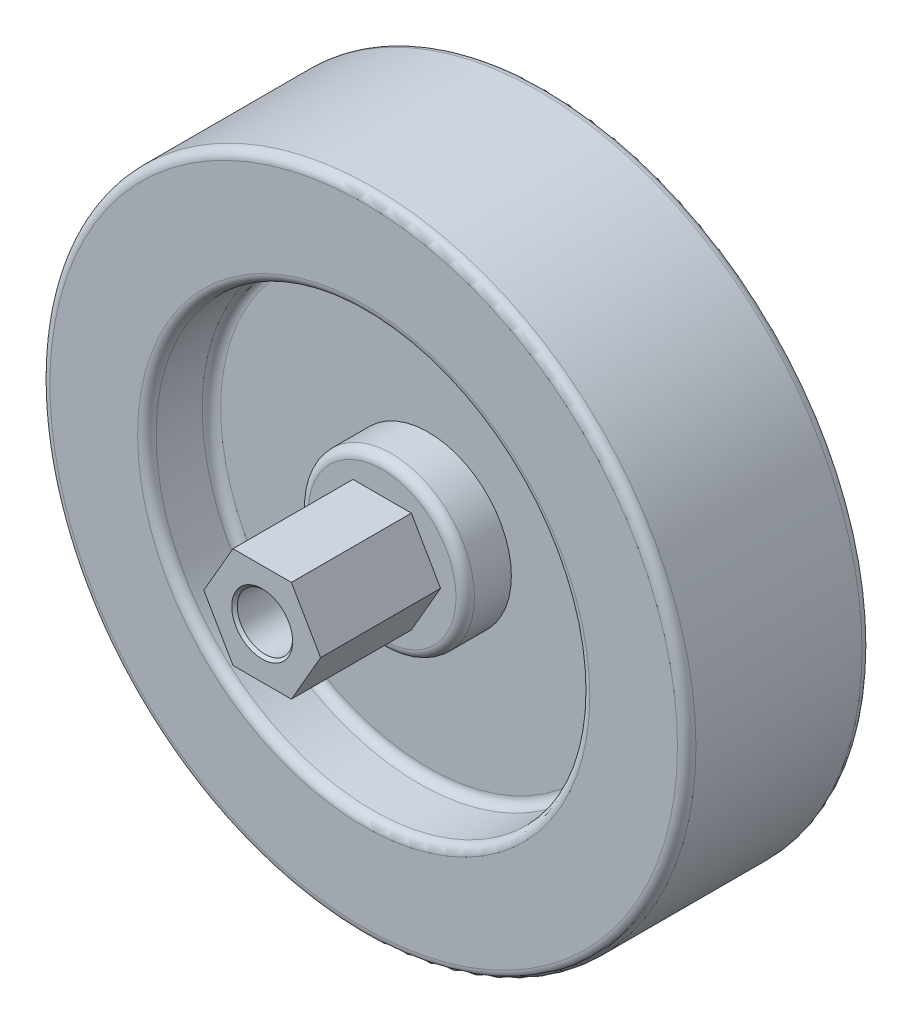
ISO-10303-21;
HEADER;
FILE_DESCRIPTION(('STEP AP214'),'2;1');
FILE_NAME('part.step','',(''),(''),'','','');
FILE_SCHEMA(('AUTOMOTIVE_DESIGN { 1 0 10303 214 1 1 1 1 }'));
ENDSEC;
DATA;
#1=APPLICATION_CONTEXT('core data for automotive mechanical design processes');
#2=APPLICATION_PROTOCOL_DEFINITION('international standard','automotive_design',2000,#1);
#3=PRODUCT_CONTEXT('',#1,'mechanical');
#4=PRODUCT('Part','Part','',(#3));
#5=PRODUCT_RELATED_PRODUCT_CATEGORY('part','',(#4));
#6=PRODUCT_DEFINITION_FORMATION('','',#4);
#7=PRODUCT_DEFINITION_CONTEXT('part definition',#1,'design');
#8=PRODUCT_DEFINITION('design','',#6,#7);
#9=PRODUCT_DEFINITION_SHAPE('','',#8);
#10=(LENGTH_UNIT() NAMED_UNIT(*) SI_UNIT(.MILLI.,.METRE.));
#11=(NAMED_UNIT(*) PLANE_ANGLE_UNIT() SI_UNIT($,.RADIAN.));
#12=(NAMED_UNIT(*) SI_UNIT($,.STERADIAN.) SOLID_ANGLE_UNIT());
#13=UNCERTAINTY_MEASURE_WITH_UNIT(LENGTH_MEASURE(1.E-05),#10,'distance_accuracy_value','');
#14=(GEOMETRIC_REPRESENTATION_CONTEXT(3) GLOBAL_UNCERTAINTY_ASSIGNED_CONTEXT((#13)) GLOBAL_UNIT_ASSIGNED_CONTEXT((#10,
#11,#12)) REPRESENTATION_CONTEXT('',''));
#15=CARTESIAN_POINT('',(0.,0.,0.));
#16=DIRECTION('',(0.,0.,1.));
#17=DIRECTION('',(1.,0.,0.));
#18=AXIS2_PLACEMENT_3D('',#15,#16,#17);
#19=CARTESIAN_POINT('',(0.,0.,20.));
#20=DIRECTION('',(0.,0.,1.));
#21=DIRECTION('',(1.,0.,0.));
#22=AXIS2_PLACEMENT_3D('',#19,#20,#21);
#23=PLANE('',#22);
#24=CARTESIAN_POINT('',(0.,0.,20.));
#25=DIRECTION('',(0.,0.,1.));
#26=DIRECTION('',(1.,0.,0.));
#27=AXIS2_PLACEMENT_3D('',#24,#25,#26);
#28=CIRCLE('',#27,24.5);
#29=CARTESIAN_POINT('',(24.5000000000001,0.,20.));
#30=VERTEX_POINT('',#29);
#31=EDGE_CURVE('E168',#30,#30,#28,.F.);
#32=ORIENTED_EDGE('',*,*,#31,.T.);
#33=EDGE_LOOP('',(#32));
#34=FACE_BOUND('',#33,.T.);
#35=CARTESIAN_POINT('',(0.,0.,20.));
#36=DIRECTION('',(0.,0.,1.));
#37=DIRECTION('',(1.,0.,0.));
#38=AXIS2_PLACEMENT_3D('',#35,#36,#37);
#39=CIRCLE('',#38,34.);
#40=CARTESIAN_POINT('',(34.0000000000001,0.,20.));
#41=VERTEX_POINT('',#40);
#42=EDGE_CURVE('E165',#41,#41,#39,.T.);
#43=ORIENTED_EDGE('',*,*,#42,.T.);
#44=EDGE_LOOP('',(#43));
#45=FACE_BOUND('',#44,.T.);
#46=ADVANCED_FACE('F44',(#34,#45),#23,.T.);
#47=CARTESIAN_POINT('',(0.,0.,0.));
#48=DIRECTION('',(0.,0.,1.));
#49=DIRECTION('',(1.,0.,0.));
#50=AXIS2_PLACEMENT_3D('',#47,#48,#49);
#51=PLANE('',#50);
#52=CARTESIAN_POINT('',(0.,0.,0.));
#53=DIRECTION('',(0.,0.,1.));
#54=DIRECTION('',(1.,0.,0.));
#55=AXIS2_PLACEMENT_3D('',#52,#53,#54);
#56=CIRCLE('',#55,25.);
#57=CARTESIAN_POINT('',(25.,0.,0.));
#58=VERTEX_POINT('',#57);
#59=EDGE_CURVE('E177',#58,#58,#56,.T.);
#60=ORIENTED_EDGE('',*,*,#59,.T.);
#61=EDGE_LOOP('',(#60));
#62=FACE_BOUND('',#61,.T.);
#63=CARTESIAN_POINT('',(0.,0.,0.));
#64=DIRECTION('',(0.,0.,1.));
#65=DIRECTION('',(1.,0.,0.));
#66=AXIS2_PLACEMENT_3D('',#63,#64,#65);
#67=CIRCLE('',#66,34.);
#68=CARTESIAN_POINT('',(34.0000000000001,0.,0.));
#69=VERTEX_POINT('',#68);
#70=EDGE_CURVE('E174',#69,#69,#67,.F.);
#71=ORIENTED_EDGE('',*,*,#70,.T.);
#72=EDGE_LOOP('',(#71));
#73=FACE_BOUND('',#72,.T.);
#74=ADVANCED_FACE('F205',(#62,#73),#51,.F.);
#75=CARTESIAN_POINT('',(0.,0.,20.));
#76=DIRECTION('',(0.,0.,-1.));
#77=DIRECTION('',(-1.,0.,0.));
#78=AXIS2_PLACEMENT_3D('',#75,#76,#77);
#79=CYLINDRICAL_SURFACE('',#78,35.);
#80=CARTESIAN_POINT('',(0.,0.,1.));
#81=DIRECTION('',(0.,0.,1.));
#82=DIRECTION('',(1.,0.,0.));
#83=AXIS2_PLACEMENT_3D('',#80,#81,#82);
#84=CIRCLE('',#83,35.);
#85=CARTESIAN_POINT('',(35.0000000000001,0.,1.));
#86=VERTEX_POINT('',#85);
#87=EDGE_CURVE('E183',#86,#86,#84,.T.);
#88=ORIENTED_EDGE('',*,*,#87,.T.);
#89=EDGE_LOOP('',(#88));
#90=FACE_BOUND('',#89,.T.);
#91=CARTESIAN_POINT('',(0.,0.,19.));
#92=DIRECTION('',(0.,0.,1.));
#93=DIRECTION('',(1.,0.,0.));
#94=AXIS2_PLACEMENT_3D('',#91,#92,#93);
#95=CIRCLE('',#94,35.);
#96=CARTESIAN_POINT('',(35.0000000000001,-1.16295861829485E-13,19.));
#97=VERTEX_POINT('',#96);
#98=EDGE_CURVE('E180',#97,#97,#95,.F.);
#99=ORIENTED_EDGE('',*,*,#98,.T.);
#100=EDGE_LOOP('',(#99));
#101=FACE_BOUND('',#100,.T.);
#102=ADVANCED_FACE('F211',(#90,#101),#79,.T.);
#103=CARTESIAN_POINT('',(0.,0.,20.));
#104=DIRECTION('',(0.,0.,-1.));
#105=DIRECTION('',(-1.,0.,0.));
#106=AXIS2_PLACEMENT_3D('',#103,#104,#105);
#107=CYLINDRICAL_SURFACE('',#106,23.5);
#108=CARTESIAN_POINT('',(0.,0.,14.));
#109=DIRECTION('',(0.,0.,1.));
#110=DIRECTION('',(1.,0.,0.));
#111=AXIS2_PLACEMENT_3D('',#108,#109,#110);
#112=CIRCLE('',#111,23.5);
#113=CARTESIAN_POINT('',(23.5000000000001,0.,14.));
#114=VERTEX_POINT('',#113);
#115=EDGE_CURVE('E162',#114,#114,#112,.F.);
#116=ORIENTED_EDGE('',*,*,#115,.T.);
#117=EDGE_LOOP('',(#116));
#118=FACE_BOUND('',#117,.T.);
#119=CARTESIAN_POINT('',(0.,0.,19.));
#120=DIRECTION('',(0.,0.,1.));
#121=DIRECTION('',(1.,0.,0.));
#122=AXIS2_PLACEMENT_3D('',#119,#120,#121);
#123=CIRCLE('',#122,23.5);
#124=CARTESIAN_POINT('',(23.5000000000001,-1.05443431763774E-13,19.));
#125=VERTEX_POINT('',#124);
#126=EDGE_CURVE('E159',#125,#125,#123,.T.);
#127=ORIENTED_EDGE('',*,*,#126,.T.);
#128=EDGE_LOOP('',(#127));
#129=FACE_BOUND('',#128,.T.);
#130=ADVANCED_FACE('F216',(#118,#129),#107,.F.);
#131=CARTESIAN_POINT('',(0.,0.,13.));
#132=DIRECTION('',(0.,0.,1.));
#133=DIRECTION('',(1.,0.,0.));
#134=AXIS2_PLACEMENT_3D('',#131,#132,#133);
#135=PLANE('',#134);
#136=CARTESIAN_POINT('',(0.,0.,13.));
#137=DIRECTION('',(0.,0.,1.));
#138=DIRECTION('',(1.,0.,0.));
#139=AXIS2_PLACEMENT_3D('',#136,#137,#138);
#140=CIRCLE('',#139,22.5);
#141=CARTESIAN_POINT('',(22.5000000000001,0.,13.));
#142=VERTEX_POINT('',#141);
#143=EDGE_CURVE('E156',#142,#142,#140,.T.);
#144=ORIENTED_EDGE('',*,*,#143,.T.);
#145=EDGE_LOOP('',(#144));
#146=FACE_BOUND('',#145,.T.);
#147=CARTESIAN_POINT('',(0.,0.,13.));
#148=DIRECTION('',(0.,0.,1.));
#149=DIRECTION('',(1.,0.,0.));
#150=AXIS2_PLACEMENT_3D('',#147,#148,#149);
#151=CIRCLE('',#150,9.);
#152=CARTESIAN_POINT('',(9.00000000000006,0.,13.));
#153=VERTEX_POINT('',#152);
#154=EDGE_CURVE('E133',#153,#153,#151,.T.);
#155=ORIENTED_EDGE('',*,*,#154,.F.);
#156=EDGE_LOOP('',(#155));
#157=FACE_BOUND('',#156,.T.);
#158=ADVANCED_FACE('F303',(#146,#157),#135,.T.);
#159=CARTESIAN_POINT('',(0.,0.,13.));
#160=DIRECTION('',(0.,0.,1.));
#161=DIRECTION('',(1.,0.,0.));
#162=AXIS2_PLACEMENT_3D('',#159,#160,#161);
#163=CYLINDRICAL_SURFACE('',#162,9.);
#164=CARTESIAN_POINT('',(0.,0.,17.));
#165=DIRECTION('',(0.,0.,1.));
#166=DIRECTION('',(1.,0.,0.));
#167=AXIS2_PLACEMENT_3D('',#164,#165,#166);
#168=CIRCLE('',#167,9.);
#169=CARTESIAN_POINT('',(9.,0.,17.));
#170=VERTEX_POINT('',#169);
#171=EDGE_CURVE('E153',#170,#170,#168,.F.);
#172=ORIENTED_EDGE('',*,*,#171,.T.);
#173=EDGE_LOOP('',(#172));
#174=FACE_BOUND('',#173,.T.);
#175=ORIENTED_EDGE('',*,*,#154,.T.);
#176=EDGE_LOOP('',(#175));
#177=FACE_BOUND('',#176,.T.);
#178=ADVANCED_FACE('F311',(#174,#177),#163,.T.);
#179=CARTESIAN_POINT('',(0.,0.,31.));
#180=DIRECTION('',(0.,0.,1.));
#181=DIRECTION('',(1.,0.,0.));
#182=AXIS2_PLACEMENT_3D('',#179,#180,#181);
#183=PLANE('',#182);
#184=CARTESIAN_POINT('',(0.,0.,31.));
#185=DIRECTION('',(0.,0.,1.));
#186=DIRECTION('',(1.,0.,0.));
#187=AXIS2_PLACEMENT_3D('',#184,#185,#186);
#188=CIRCLE('',#187,3.29999999999998);
#189=CARTESIAN_POINT('',(3.29999999999997,0.,31.));
#190=VERTEX_POINT('',#189);
#191=EDGE_CURVE('E11',#190,#190,#188,.F.);
#192=ORIENTED_EDGE('',*,*,#191,.T.);
#193=EDGE_LOOP('',(#192));
#194=FACE_BOUND('',#193,.T.);
#195=DIRECTION('',(0.500000000000002,0.866025403784438,0.));
#196=VECTOR('',#195,1.);
#197=CARTESIAN_POINT('',(3.16357794064081,-5.47947772689407,31.));
#198=LINE('',#197,#196);
#199=CARTESIAN_POINT('',(3.16357794064081,-5.47947772689407,31.));
#200=VERTEX_POINT('',#199);
#201=CARTESIAN_POINT('',(6.3271558812816,0.,31.));
#202=VERTEX_POINT('',#201);
#203=EDGE_CURVE('E141',#200,#202,#198,.T.);
#204=ORIENTED_EDGE('',*,*,#203,.T.);
#205=DIRECTION('',(-0.5,0.866025403784442,0.));
#206=VECTOR('',#205,1.);
#207=CARTESIAN_POINT('',(6.3271558812816,0.,31.));
#208=LINE('',#207,#206);
#209=CARTESIAN_POINT('',(3.16357794064082,5.47947772689397,31.));
#210=VERTEX_POINT('',#209);
#211=EDGE_CURVE('E96',#202,#210,#208,.T.);
#212=ORIENTED_EDGE('',*,*,#211,.T.);
#213=DIRECTION('',(-1.,0.,0.));
#214=VECTOR('',#213,1.);
#215=CARTESIAN_POINT('',(3.16357794064082,5.47947772689397,31.));
#216=LINE('',#215,#214);
#217=CARTESIAN_POINT('',(-3.16357794064081,5.479477726894,30.9999999999999));
#218=VERTEX_POINT('',#217);
#219=EDGE_CURVE('E109',#210,#218,#216,.T.);
#220=ORIENTED_EDGE('',*,*,#219,.T.);
#221=DIRECTION('',(-0.500000000000002,-0.866025403784438,0.));
#222=VECTOR('',#221,1.);
#223=CARTESIAN_POINT('',(-3.16357794064081,5.479477726894,30.9999999999999));
#224=LINE('',#223,#222);
#225=CARTESIAN_POINT('',(-6.32715588128163,0.,30.9999999999999));
#226=VERTEX_POINT('',#225);
#227=EDGE_CURVE('E103',#218,#226,#224,.T.);
#228=ORIENTED_EDGE('',*,*,#227,.T.);
#229=DIRECTION('',(0.499999999999999,-0.866025403784442,0.));
#230=VECTOR('',#229,1.);
#231=CARTESIAN_POINT('',(-6.32715588128163,0.,30.9999999999999));
#232=LINE('',#231,#230);
#233=CARTESIAN_POINT('',(-3.16357794064084,-5.4794777268941,31.));
#234=VERTEX_POINT('',#233);
#235=EDGE_CURVE('E107',#226,#234,#232,.T.);
#236=ORIENTED_EDGE('',*,*,#235,.T.);
#237=DIRECTION('',(1.,0.,0.));
#238=VECTOR('',#237,1.);
#239=CARTESIAN_POINT('',(-3.16357794064084,-5.4794777268941,31.));
#240=LINE('',#239,#238);
#241=EDGE_CURVE('E68',#234,#200,#240,.T.);
#242=ORIENTED_EDGE('',*,*,#241,.T.);
#243=EDGE_LOOP('',(#204,#212,#220,#228,#236,#242));
#244=FACE_BOUND('',#243,.T.);
#245=ADVANCED_FACE('F105',(#194,#244),#183,.T.);
#246=CARTESIAN_POINT('',(3.16357794064082,5.47947772689397,31.));
#247=DIRECTION('',(0.,-1.,0.));
#248=DIRECTION('',(1.,0.,0.));
#249=AXIS2_PLACEMENT_3D('',#246,#247,#248);
#250=PLANE('',#249);
#251=DIRECTION('',(-1.,0.,0.));
#252=VECTOR('',#251,1.);
#253=CARTESIAN_POINT('',(3.16357794064089,5.47947772689392,18.));
#254=LINE('',#253,#252);
#255=CARTESIAN_POINT('',(3.16357794064089,5.47947772689392,18.));
#256=VERTEX_POINT('',#255);
#257=CARTESIAN_POINT('',(-3.16357794064074,5.47947772689396,18.));
#258=VERTEX_POINT('',#257);
#259=EDGE_CURVE('E135',#256,#258,#254,.T.);
#260=ORIENTED_EDGE('',*,*,#259,.T.);
#261=DIRECTION('',(0.,0.,-1.));
#262=VECTOR('',#261,1.);
#263=CARTESIAN_POINT('',(-3.16357794064081,5.479477726894,30.9999999999999));
#264=LINE('',#263,#262);
#265=EDGE_CURVE('E121',#218,#258,#264,.T.);
#266=ORIENTED_EDGE('',*,*,#265,.F.);
#267=ORIENTED_EDGE('',*,*,#219,.F.);
#268=DIRECTION('',(0.,0.,-1.));
#269=VECTOR('',#268,1.);
#270=CARTESIAN_POINT('',(3.16357794064082,5.47947772689397,31.));
#271=LINE('',#270,#269);
#272=EDGE_CURVE('E145',#210,#256,#271,.T.);
#273=ORIENTED_EDGE('',*,*,#272,.T.);
#274=EDGE_LOOP('',(#260,#266,#267,#273));
#275=FACE_BOUND('',#274,.T.);
#276=ADVANCED_FACE('F329',(#275),#250,.F.);
#277=CARTESIAN_POINT('',(-3.16357794064081,5.479477726894,30.9999999999999));
#278=DIRECTION('',(0.866025403784439,-0.500000000000004,0.));
#279=DIRECTION('',(0.500000000000002,0.866025403784439,0.));
#280=AXIS2_PLACEMENT_3D('',#277,#278,#279);
#281=PLANE('',#280);
#282=DIRECTION('',(-0.500000000000002,-0.866025403784438,0.));
#283=VECTOR('',#282,1.);
#284=CARTESIAN_POINT('',(-3.16357794064074,5.47947772689396,18.));
#285=LINE('',#284,#283);
#286=CARTESIAN_POINT('',(-6.32715588128158,0.,18.));
#287=VERTEX_POINT('',#286);
#288=EDGE_CURVE('E118',#258,#287,#285,.T.);
#289=ORIENTED_EDGE('',*,*,#288,.T.);
#290=DIRECTION('',(0.,0.,-1.));
#291=VECTOR('',#290,1.);
#292=CARTESIAN_POINT('',(-6.32715588128163,0.,30.9999999999999));
#293=LINE('',#292,#291);
#294=EDGE_CURVE('E115',#226,#287,#293,.T.);
#295=ORIENTED_EDGE('',*,*,#294,.F.);
#296=ORIENTED_EDGE('',*,*,#227,.F.);
#297=ORIENTED_EDGE('',*,*,#265,.T.);
#298=EDGE_LOOP('',(#289,#295,#296,#297));
#299=FACE_BOUND('',#298,.T.);
#300=ADVANCED_FACE('F116',(#299),#281,.F.);
#301=CARTESIAN_POINT('',(-6.32715588128163,0.,30.9999999999999));
#302=DIRECTION('',(0.866025403784441,0.499999999999997,0.));
#303=DIRECTION('',(-0.499999999999999,0.866025403784442,0.));
#304=AXIS2_PLACEMENT_3D('',#301,#302,#303);
#305=PLANE('',#304);
#306=DIRECTION('',(0.499999999999999,-0.866025403784442,0.));
#307=VECTOR('',#306,1.);
#308=CARTESIAN_POINT('',(-6.32715588128158,0.,18.));
#309=LINE('',#308,#307);
#310=CARTESIAN_POINT('',(-3.16357794064073,-5.47947772689408,18.));
#311=VERTEX_POINT('',#310);
#312=EDGE_CURVE('E138',#287,#311,#309,.T.);
#313=ORIENTED_EDGE('',*,*,#312,.T.);
#314=DIRECTION('',(0.,0.,-1.));
#315=VECTOR('',#314,1.);
#316=CARTESIAN_POINT('',(-3.16357794064084,-5.4794777268941,31.));
#317=LINE('',#316,#315);
#318=EDGE_CURVE('E60',#234,#311,#317,.T.);
#319=ORIENTED_EDGE('',*,*,#318,.F.);
#320=ORIENTED_EDGE('',*,*,#235,.F.);
#321=ORIENTED_EDGE('',*,*,#294,.T.);
#322=EDGE_LOOP('',(#313,#319,#320,#321));
#323=FACE_BOUND('',#322,.T.);
#324=ADVANCED_FACE('F123',(#323),#305,.F.);
#325=CARTESIAN_POINT('',(-3.16357794064084,-5.4794777268941,31.));
#326=DIRECTION('',(0.,1.,0.));
#327=DIRECTION('',(-1.,0.,0.));
#328=AXIS2_PLACEMENT_3D('',#325,#326,#327);
#329=PLANE('',#328);
#330=DIRECTION('',(1.,0.,0.));
#331=VECTOR('',#330,1.);
#332=CARTESIAN_POINT('',(-3.16357794064073,-5.47947772689408,18.));
#333=LINE('',#332,#331);
#334=CARTESIAN_POINT('',(3.16357794064092,-5.47947772689415,17.9999999999999));
#335=VERTEX_POINT('',#334);
#336=EDGE_CURVE('E88',#311,#335,#333,.T.);
#337=ORIENTED_EDGE('',*,*,#336,.T.);
#338=DIRECTION('',(0.,0.,-1.));
#339=VECTOR('',#338,1.);
#340=CARTESIAN_POINT('',(3.16357794064081,-5.47947772689407,31.));
#341=LINE('',#340,#339);
#342=EDGE_CURVE('E125',#200,#335,#341,.T.);
#343=ORIENTED_EDGE('',*,*,#342,.F.);
#344=ORIENTED_EDGE('',*,*,#241,.F.);
#345=ORIENTED_EDGE('',*,*,#318,.T.);
#346=EDGE_LOOP('',(#337,#343,#344,#345));
#347=FACE_BOUND('',#346,.T.);
#348=ADVANCED_FACE('F355',(#347),#329,.F.);
#349=CARTESIAN_POINT('',(3.16357794064081,-5.47947772689407,31.));
#350=DIRECTION('',(-0.866025403784439,0.500000000000004,0.));
#351=DIRECTION('',(-0.500000000000002,-0.866025403784439,0.));
#352=AXIS2_PLACEMENT_3D('',#349,#350,#351);
#353=PLANE('',#352);
#354=DIRECTION('',(0.500000000000002,0.866025403784438,0.));
#355=VECTOR('',#354,1.);
#356=CARTESIAN_POINT('',(3.16357794064092,-5.47947772689415,17.9999999999999));
#357=LINE('',#356,#355);
#358=CARTESIAN_POINT('',(6.32715588128171,0.,18.));
#359=VERTEX_POINT('',#358);
#360=EDGE_CURVE('E129',#335,#359,#357,.T.);
#361=ORIENTED_EDGE('',*,*,#360,.T.);
#362=DIRECTION('',(0.,0.,-1.));
#363=VECTOR('',#362,1.);
#364=CARTESIAN_POINT('',(6.3271558812816,0.,31.));
#365=LINE('',#364,#363);
#366=EDGE_CURVE('E148',#202,#359,#365,.T.);
#367=ORIENTED_EDGE('',*,*,#366,.F.);
#368=ORIENTED_EDGE('',*,*,#203,.F.);
#369=ORIENTED_EDGE('',*,*,#342,.T.);
#370=EDGE_LOOP('',(#361,#367,#368,#369));
#371=FACE_BOUND('',#370,.T.);
#372=ADVANCED_FACE('F362',(#371),#353,.F.);
#373=CARTESIAN_POINT('',(6.3271558812816,0.,31.));
#374=DIRECTION('',(-0.866025403784441,-0.499999999999997,0.));
#375=DIRECTION('',(0.5,-0.866025403784442,0.));
#376=AXIS2_PLACEMENT_3D('',#373,#374,#375);
#377=PLANE('',#376);
#378=DIRECTION('',(-0.5,0.866025403784442,0.));
#379=VECTOR('',#378,1.);
#380=CARTESIAN_POINT('',(6.32715588128171,0.,18.));
#381=LINE('',#380,#379);
#382=EDGE_CURVE('E132',#359,#256,#381,.T.);
#383=ORIENTED_EDGE('',*,*,#382,.T.);
#384=ORIENTED_EDGE('',*,*,#272,.F.);
#385=ORIENTED_EDGE('',*,*,#211,.F.);
#386=ORIENTED_EDGE('',*,*,#366,.T.);
#387=EDGE_LOOP('',(#383,#384,#385,#386));
#388=FACE_BOUND('',#387,.T.);
#389=ADVANCED_FACE('F369',(#388),#377,.F.);
#390=CARTESIAN_POINT('',(1.11022302462516E-13,0.,18.));
#391=DIRECTION('',(0.,0.,1.));
#392=DIRECTION('',(1.,0.,0.));
#393=AXIS2_PLACEMENT_3D('',#390,#391,#392);
#394=PLANE('',#393);
#395=CARTESIAN_POINT('',(1.11022302462516E-13,0.,18.));
#396=DIRECTION('',(0.,0.,1.));
#397=DIRECTION('',(1.,0.,0.));
#398=AXIS2_PLACEMENT_3D('',#395,#396,#397);
#399=CIRCLE('',#398,8.);
#400=CARTESIAN_POINT('',(8.00000000000012,0.,18.));
#401=VERTEX_POINT('',#400);
#402=EDGE_CURVE('E150',#401,#401,#399,.T.);
#403=ORIENTED_EDGE('',*,*,#402,.T.);
#404=EDGE_LOOP('',(#403));
#405=FACE_BOUND('',#404,.T.);
#406=ORIENTED_EDGE('',*,*,#382,.F.);
#407=ORIENTED_EDGE('',*,*,#360,.F.);
#408=ORIENTED_EDGE('',*,*,#336,.F.);
#409=ORIENTED_EDGE('',*,*,#312,.F.);
#410=ORIENTED_EDGE('',*,*,#288,.F.);
#411=ORIENTED_EDGE('',*,*,#259,.F.);
#412=EDGE_LOOP('',(#406,#407,#408,#409,#410,#411));
#413=FACE_BOUND('',#412,.T.);
#414=ADVANCED_FACE('F377',(#405,#413),#394,.T.);
#415=CARTESIAN_POINT('',(0.,0.,19.));
#416=DIRECTION('',(0.,0.,1.));
#417=DIRECTION('',(1.,0.,0.));
#418=AXIS2_PLACEMENT_3D('',#415,#416,#417);
#419=CYLINDRICAL_SURFACE('',#418,3.);
#420=CARTESIAN_POINT('',(0.,0.,30.7));
#421=DIRECTION('',(0.,0.,1.));
#422=DIRECTION('',(1.,0.,0.));
#423=AXIS2_PLACEMENT_3D('',#420,#421,#422);
#424=CIRCLE('',#423,3.);
#425=CARTESIAN_POINT('',(2.99999999999999,0.,30.7));
#426=VERTEX_POINT('',#425);
#427=EDGE_CURVE('E53',#426,#426,#424,.T.);
#428=ORIENTED_EDGE('',*,*,#427,.T.);
#429=EDGE_LOOP('',(#428));
#430=FACE_BOUND('',#429,.T.);
#431=CARTESIAN_POINT('',(0.,0.,19.));
#432=DIRECTION('',(0.,0.,1.));
#433=DIRECTION('',(1.,0.,0.));
#434=AXIS2_PLACEMENT_3D('',#431,#432,#433);
#435=CIRCLE('',#434,3.);
#436=CARTESIAN_POINT('',(3.00000000000007,0.,19.));
#437=VERTEX_POINT('',#436);
#438=EDGE_CURVE('E188',#437,#437,#435,.T.);
#439=ORIENTED_EDGE('',*,*,#438,.F.);
#440=EDGE_LOOP('',(#439));
#441=FACE_BOUND('',#440,.T.);
#442=ADVANCED_FACE('F192',(#430,#441),#419,.F.);
#443=CARTESIAN_POINT('',(0.,0.,19.));
#444=DIRECTION('',(0.,0.,1.));
#445=DIRECTION('',(1.,0.,0.));
#446=AXIS2_PLACEMENT_3D('',#443,#444,#445);
#447=PLANE('',#446);
#448=ORIENTED_EDGE('',*,*,#438,.T.);
#449=EDGE_LOOP('',(#448));
#450=FACE_BOUND('',#449,.T.);
#451=ADVANCED_FACE('F390',(#450),#447,.T.);
#452=CARTESIAN_POINT('',(0.,0.,2.));
#453=DIRECTION('',(0.,0.,-1.));
#454=DIRECTION('',(-1.,0.,0.));
#455=AXIS2_PLACEMENT_3D('',#452,#453,#454);
#456=PLANE('',#455);
#457=CARTESIAN_POINT('',(0.,0.,2.));
#458=DIRECTION('',(0.,0.,-1.));
#459=DIRECTION('',(-1.,0.,0.));
#460=AXIS2_PLACEMENT_3D('',#457,#458,#459);
#461=CIRCLE('',#460,23.);
#462=CARTESIAN_POINT('',(-23.,0.,2.));
#463=VERTEX_POINT('',#462);
#464=EDGE_CURVE('E171',#463,#463,#461,.T.);
#465=ORIENTED_EDGE('',*,*,#464,.T.);
#466=EDGE_LOOP('',(#465));
#467=FACE_BOUND('',#466,.T.);
#468=ADVANCED_FACE('F226',(#467),#456,.T.);
#469=CARTESIAN_POINT('',(0.,0.,17.));
#470=DIRECTION('',(0.,0.,1.));
#471=DIRECTION('',(1.,0.,0.));
#472=AXIS2_PLACEMENT_3D('',#469,#470,#471);
#473=TOROIDAL_SURFACE('',#472,8.,1.);
#474=ORIENTED_EDGE('',*,*,#171,.F.);
#475=EDGE_LOOP('',(#474));
#476=FACE_BOUND('',#475,.T.);
#477=ORIENTED_EDGE('',*,*,#402,.F.);
#478=EDGE_LOOP('',(#477));
#479=FACE_BOUND('',#478,.T.);
#480=ADVANCED_FACE('F222',(#476,#479),#473,.T.);
#481=CARTESIAN_POINT('',(0.,0.,14.));
#482=DIRECTION('',(0.,0.,1.));
#483=DIRECTION('',(1.,0.,0.));
#484=AXIS2_PLACEMENT_3D('',#481,#482,#483);
#485=TOROIDAL_SURFACE('',#484,22.5,1.);
#486=ORIENTED_EDGE('',*,*,#115,.F.);
#487=EDGE_LOOP('',(#486));
#488=FACE_BOUND('',#487,.T.);
#489=ORIENTED_EDGE('',*,*,#143,.F.);
#490=EDGE_LOOP('',(#489));
#491=FACE_BOUND('',#490,.T.);
#492=ADVANCED_FACE('F225',(#488,#491),#485,.F.);
#493=CARTESIAN_POINT('',(0.,0.,19.));
#494=DIRECTION('',(0.,0.,1.));
#495=DIRECTION('',(1.,0.,0.));
#496=AXIS2_PLACEMENT_3D('',#493,#494,#495);
#497=TOROIDAL_SURFACE('',#496,24.5,1.);
#498=ORIENTED_EDGE('',*,*,#31,.F.);
#499=EDGE_LOOP('',(#498));
#500=FACE_BOUND('',#499,.T.);
#501=ORIENTED_EDGE('',*,*,#126,.F.);
#502=EDGE_LOOP('',(#501));
#503=FACE_BOUND('',#502,.T.);
#504=ADVANCED_FACE('F230',(#500,#503),#497,.T.);
#505=CARTESIAN_POINT('',(0.,0.,1.));
#506=DIRECTION('',(0.,0.,1.));
#507=DIRECTION('',(1.,0.,0.));
#508=AXIS2_PLACEMENT_3D('',#505,#506,#507);
#509=TOROIDAL_SURFACE('',#508,25.,1.);
#510=ORIENTED_EDGE('',*,*,#59,.F.);
#511=EDGE_LOOP('',(#510));
#512=FACE_BOUND('',#511,.T.);
#513=CARTESIAN_POINT('',(0.,0.,1.));
#514=DIRECTION('',(0.,0.,1.));
#515=DIRECTION('',(1.,0.,0.));
#516=AXIS2_PLACEMENT_3D('',#513,#514,#515);
#517=CIRCLE('',#516,24.);
#518=CARTESIAN_POINT('',(24.,0.,1.));
#519=VERTEX_POINT('',#518);
#520=EDGE_CURVE('E186',#519,#519,#517,.F.);
#521=ORIENTED_EDGE('',*,*,#520,.F.);
#522=EDGE_LOOP('',(#521));
#523=FACE_BOUND('',#522,.T.);
#524=ADVANCED_FACE('F234',(#512,#523),#509,.T.);
#525=CARTESIAN_POINT('',(0.,0.,1.));
#526=DIRECTION('',(0.,0.,-1.));
#527=DIRECTION('',(-1.,0.,0.));
#528=AXIS2_PLACEMENT_3D('',#525,#526,#527);
#529=TOROIDAL_SURFACE('',#528,23.,1.);
#530=ORIENTED_EDGE('',*,*,#520,.T.);
#531=EDGE_LOOP('',(#530));
#532=FACE_BOUND('',#531,.T.);
#533=ORIENTED_EDGE('',*,*,#464,.F.);
#534=EDGE_LOOP('',(#533));
#535=FACE_BOUND('',#534,.T.);
#536=ADVANCED_FACE('F236',(#532,#535),#529,.F.);
#537=CARTESIAN_POINT('',(0.,0.,1.));
#538=DIRECTION('',(0.,0.,1.));
#539=DIRECTION('',(1.,0.,0.));
#540=AXIS2_PLACEMENT_3D('',#537,#538,#539);
#541=TOROIDAL_SURFACE('',#540,34.,1.);
#542=ORIENTED_EDGE('',*,*,#70,.F.);
#543=EDGE_LOOP('',(#542));
#544=FACE_BOUND('',#543,.T.);
#545=ORIENTED_EDGE('',*,*,#87,.F.);
#546=EDGE_LOOP('',(#545));
#547=FACE_BOUND('',#546,.T.);
#548=ADVANCED_FACE('F201',(#544,#547),#541,.T.);
#549=CARTESIAN_POINT('',(0.,0.,19.));
#550=DIRECTION('',(0.,0.,1.));
#551=DIRECTION('',(1.,0.,0.));
#552=AXIS2_PLACEMENT_3D('',#549,#550,#551);
#553=TOROIDAL_SURFACE('',#552,34.,1.);
#554=ORIENTED_EDGE('',*,*,#98,.F.);
#555=EDGE_LOOP('',(#554));
#556=FACE_BOUND('',#555,.T.);
#557=ORIENTED_EDGE('',*,*,#42,.F.);
#558=EDGE_LOOP('',(#557));
#559=FACE_BOUND('',#558,.T.);
#560=ADVANCED_FACE('F196',(#556,#559),#553,.T.);
#561=CARTESIAN_POINT('',(0.,0.,30.7));
#562=DIRECTION('',(0.,0.,1.));
#563=DIRECTION('',(1.,0.,0.));
#564=AXIS2_PLACEMENT_3D('',#561,#562,#563);
#565=CONICAL_SURFACE('',#564,3.,0.78539816339744);
#566=ORIENTED_EDGE('',*,*,#191,.F.);
#567=EDGE_LOOP('',(#566));
#568=FACE_BOUND('',#567,.T.);
#569=ORIENTED_EDGE('',*,*,#427,.F.);
#570=EDGE_LOOP('',(#569));
#571=FACE_BOUND('',#570,.T.);
#572=ADVANCED_FACE('F47',(#568,#571),#565,.F.);
#573=CLOSED_SHELL('',(#46,#74,#102,#130,#158,#178,#245,#276,#300,#324,#348,#372,#389,#414,#442,
#451,#468,#480,#492,#504,#524,#536,#548,#560,#572));
#574=MANIFOLD_SOLID_BREP('B2',#573);
#575=ADVANCED_BREP_SHAPE_REPRESENTATION('',(#18,#574),#14);
#576=SHAPE_DEFINITION_REPRESENTATION(#9,#575);
ENDSEC;
END-ISO-10303-21;
